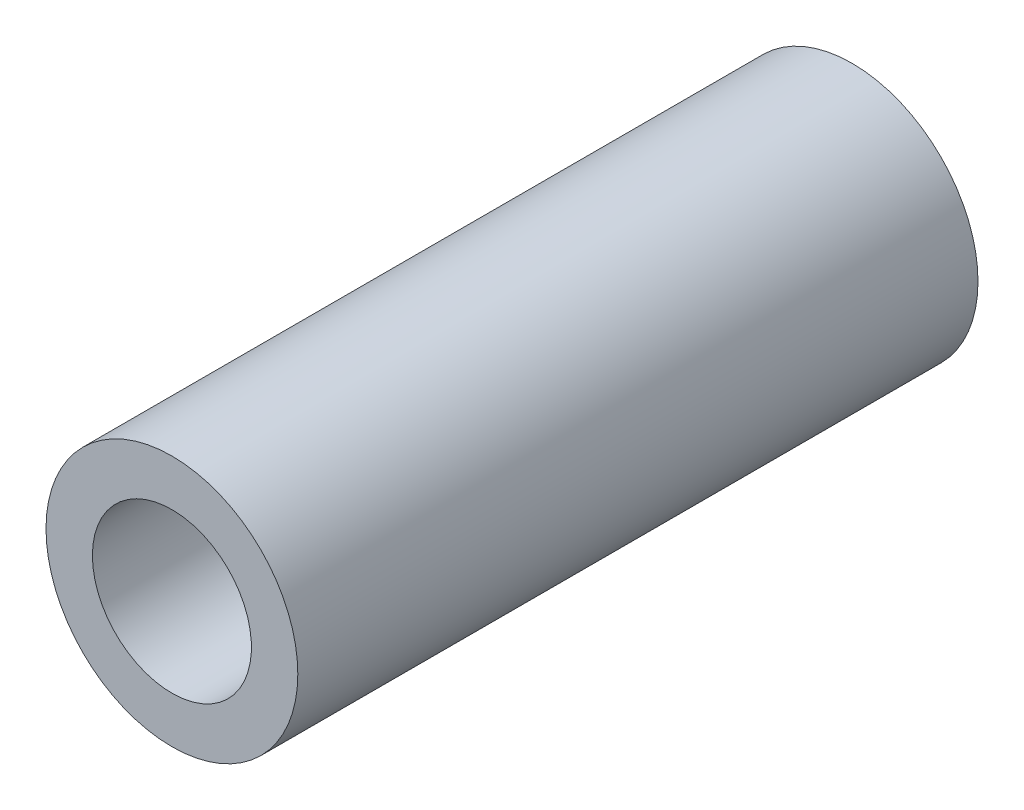
ISO-10303-21;
HEADER;
FILE_DESCRIPTION(('STEP AP214'),'2;1');
FILE_NAME('part.step','',(''),(''),'','','');
FILE_SCHEMA(('AUTOMOTIVE_DESIGN { 1 0 10303 214 1 1 1 1 }'));
ENDSEC;
DATA;
#1=APPLICATION_CONTEXT('core data for automotive mechanical design processes');
#2=APPLICATION_PROTOCOL_DEFINITION('international standard','automotive_design',2000,#1);
#3=PRODUCT_CONTEXT('',#1,'mechanical');
#4=PRODUCT('Part','Part','',(#3));
#5=PRODUCT_RELATED_PRODUCT_CATEGORY('part','',(#4));
#6=PRODUCT_DEFINITION_FORMATION('','',#4);
#7=PRODUCT_DEFINITION_CONTEXT('part definition',#1,'design');
#8=PRODUCT_DEFINITION('design','',#6,#7);
#9=PRODUCT_DEFINITION_SHAPE('','',#8);
#10=(LENGTH_UNIT() NAMED_UNIT(*) SI_UNIT(.MILLI.,.METRE.));
#11=(NAMED_UNIT(*) PLANE_ANGLE_UNIT() SI_UNIT($,.RADIAN.));
#12=(NAMED_UNIT(*) SI_UNIT($,.STERADIAN.) SOLID_ANGLE_UNIT());
#13=UNCERTAINTY_MEASURE_WITH_UNIT(LENGTH_MEASURE(1.E-05),#10,'distance_accuracy_value','');
#14=(GEOMETRIC_REPRESENTATION_CONTEXT(3) GLOBAL_UNCERTAINTY_ASSIGNED_CONTEXT((#13)) GLOBAL_UNIT_ASSIGNED_CONTEXT((#10,
#11,#12)) REPRESENTATION_CONTEXT('',''));
#15=CARTESIAN_POINT('',(0.,0.,0.));
#16=DIRECTION('',(0.,0.,1.));
#17=DIRECTION('',(1.,0.,0.));
#18=AXIS2_PLACEMENT_3D('',#15,#16,#17);
#19=CARTESIAN_POINT('',(0.,0.,6.415));
#20=DIRECTION('',(0.,0.,1.));
#21=DIRECTION('',(1.,0.,0.));
#22=AXIS2_PLACEMENT_3D('',#19,#20,#21);
#23=PLANE('',#22);
#24=CARTESIAN_POINT('',(0.,0.,6.415));
#25=DIRECTION('',(0.,0.,1.));
#26=DIRECTION('',(1.,0.,0.));
#27=AXIS2_PLACEMENT_3D('',#24,#25,#26);
#28=CIRCLE('',#27,2.375);
#29=CARTESIAN_POINT('',(-2.375,0.,6.415));
#30=VERTEX_POINT('',#29);
#31=EDGE_CURVE('E10',#30,#30,#28,.T.);
#32=ORIENTED_EDGE('',*,*,#31,.T.);
#33=EDGE_LOOP('',(#32));
#34=FACE_BOUND('',#33,.T.);
#35=CARTESIAN_POINT('',(0.,0.,6.415));
#36=DIRECTION('',(0.,0.,1.));
#37=DIRECTION('',(1.,0.,0.));
#38=AXIS2_PLACEMENT_3D('',#35,#36,#37);
#39=CIRCLE('',#38,1.5);
#40=CARTESIAN_POINT('',(-1.5,0.,6.415));
#41=VERTEX_POINT('',#40);
#42=EDGE_CURVE('E41',#41,#41,#39,.T.);
#43=ORIENTED_EDGE('',*,*,#42,.F.);
#44=EDGE_LOOP('',(#43));
#45=FACE_BOUND('',#44,.T.);
#46=ADVANCED_FACE('F30',(#34,#45),#23,.T.);
#47=CARTESIAN_POINT('',(0.,0.,-6.415));
#48=DIRECTION('',(0.,0.,1.));
#49=DIRECTION('',(1.,0.,0.));
#50=AXIS2_PLACEMENT_3D('',#47,#48,#49);
#51=PLANE('',#50);
#52=CARTESIAN_POINT('',(0.,0.,-6.415));
#53=DIRECTION('',(0.,0.,1.));
#54=DIRECTION('',(1.,0.,0.));
#55=AXIS2_PLACEMENT_3D('',#52,#53,#54);
#56=CIRCLE('',#55,2.375);
#57=CARTESIAN_POINT('',(-2.375,0.,-6.415));
#58=VERTEX_POINT('',#57);
#59=EDGE_CURVE('E34',#58,#58,#56,.T.);
#60=ORIENTED_EDGE('',*,*,#59,.F.);
#61=EDGE_LOOP('',(#60));
#62=FACE_BOUND('',#61,.T.);
#63=CARTESIAN_POINT('',(0.,0.,-6.415));
#64=DIRECTION('',(0.,0.,1.));
#65=DIRECTION('',(1.,0.,0.));
#66=AXIS2_PLACEMENT_3D('',#63,#64,#65);
#67=CIRCLE('',#66,1.5);
#68=CARTESIAN_POINT('',(-1.5,0.,-6.415));
#69=VERTEX_POINT('',#68);
#70=EDGE_CURVE('E43',#69,#69,#67,.T.);
#71=ORIENTED_EDGE('',*,*,#70,.T.);
#72=EDGE_LOOP('',(#71));
#73=FACE_BOUND('',#72,.T.);
#74=ADVANCED_FACE('F53',(#62,#73),#51,.F.);
#75=CARTESIAN_POINT('',(0.,0.,6.415));
#76=DIRECTION('',(0.,0.,-1.));
#77=DIRECTION('',(-1.,0.,0.));
#78=AXIS2_PLACEMENT_3D('',#75,#76,#77);
#79=CYLINDRICAL_SURFACE('',#78,2.375);
#80=CARTESIAN_POINT('',(-2.375,0.,6.415));
#81=CARTESIAN_POINT('',(-2.375,0.,6.28135416666666));
#82=CARTESIAN_POINT('',(-2.375,0.,6.14770833333333));
#83=CARTESIAN_POINT('',(-2.375,0.,5.88041666666667));
#84=CARTESIAN_POINT('',(-2.375,0.,5.74677083333333));
#85=CARTESIAN_POINT('',(-2.375,0.,5.47947916666667));
#86=CARTESIAN_POINT('',(-2.375,0.,5.34583333333333));
#87=CARTESIAN_POINT('',(-2.375,0.,5.07854166666667));
#88=CARTESIAN_POINT('',(-2.375,0.,4.94489583333333));
#89=CARTESIAN_POINT('',(-2.375,0.,4.67760416666667));
#90=CARTESIAN_POINT('',(-2.375,0.,4.54395833333333));
#91=CARTESIAN_POINT('',(-2.375,0.,4.27666666666667));
#92=CARTESIAN_POINT('',(-2.375,0.,4.14302083333333));
#93=CARTESIAN_POINT('',(-2.375,0.,3.87572916666667));
#94=CARTESIAN_POINT('',(-2.375,0.,3.74208333333333));
#95=CARTESIAN_POINT('',(-2.375,0.,3.47479166666667));
#96=CARTESIAN_POINT('',(-2.375,0.,3.34114583333333));
#97=CARTESIAN_POINT('',(-2.375,0.,3.07385416666667));
#98=CARTESIAN_POINT('',(-2.375,0.,2.94020833333333));
#99=CARTESIAN_POINT('',(-2.375,0.,2.67291666666667));
#100=CARTESIAN_POINT('',(-2.375,0.,2.53927083333333));
#101=CARTESIAN_POINT('',(-2.375,0.,2.27197916666667));
#102=CARTESIAN_POINT('',(-2.375,0.,2.13833333333333));
#103=CARTESIAN_POINT('',(-2.375,0.,1.87104166666667));
#104=CARTESIAN_POINT('',(-2.375,0.,1.73739583333333));
#105=CARTESIAN_POINT('',(-2.375,0.,1.47010416666667));
#106=CARTESIAN_POINT('',(-2.375,0.,1.33645833333333));
#107=CARTESIAN_POINT('',(-2.375,0.,1.06916666666667));
#108=CARTESIAN_POINT('',(-2.375,0.,0.935520833333333));
#109=CARTESIAN_POINT('',(-2.375,0.,0.668229166666666));
#110=CARTESIAN_POINT('',(-2.375,0.,0.534583333333333));
#111=CARTESIAN_POINT('',(-2.375,0.,0.267291666666666));
#112=CARTESIAN_POINT('',(-2.375,0.,0.133645833333333));
#113=CARTESIAN_POINT('',(-2.375,0.,-0.133645833333334));
#114=CARTESIAN_POINT('',(-2.375,0.,-0.267291666666668));
#115=CARTESIAN_POINT('',(-2.375,0.,-0.534583333333335));
#116=CARTESIAN_POINT('',(-2.375,0.,-0.668229166666668));
#117=CARTESIAN_POINT('',(-2.375,0.,-0.935520833333335));
#118=CARTESIAN_POINT('',(-2.375,0.,-1.06916666666667));
#119=CARTESIAN_POINT('',(-2.375,0.,-1.33645833333333));
#120=CARTESIAN_POINT('',(-2.375,0.,-1.47010416666667));
#121=CARTESIAN_POINT('',(-2.375,0.,-1.73739583333333));
#122=CARTESIAN_POINT('',(-2.375,0.,-1.87104166666667));
#123=CARTESIAN_POINT('',(-2.375,0.,-2.13833333333333));
#124=CARTESIAN_POINT('',(-2.375,0.,-2.27197916666667));
#125=CARTESIAN_POINT('',(-2.375,0.,-2.53927083333333));
#126=CARTESIAN_POINT('',(-2.375,0.,-2.67291666666667));
#127=CARTESIAN_POINT('',(-2.375,0.,-2.94020833333333));
#128=CARTESIAN_POINT('',(-2.375,0.,-3.07385416666667));
#129=CARTESIAN_POINT('',(-2.375,0.,-3.34114583333333));
#130=CARTESIAN_POINT('',(-2.375,0.,-3.47479166666667));
#131=CARTESIAN_POINT('',(-2.375,0.,-3.74208333333333));
#132=CARTESIAN_POINT('',(-2.375,0.,-3.87572916666667));
#133=CARTESIAN_POINT('',(-2.375,0.,-4.14302083333333));
#134=CARTESIAN_POINT('',(-2.375,0.,-4.27666666666667));
#135=CARTESIAN_POINT('',(-2.375,0.,-4.54395833333333));
#136=CARTESIAN_POINT('',(-2.375,0.,-4.67760416666667));
#137=CARTESIAN_POINT('',(-2.375,0.,-4.94489583333333));
#138=CARTESIAN_POINT('',(-2.375,0.,-5.07854166666667));
#139=CARTESIAN_POINT('',(-2.375,0.,-5.34583333333333));
#140=CARTESIAN_POINT('',(-2.375,0.,-5.47947916666667));
#141=CARTESIAN_POINT('',(-2.375,0.,-5.74677083333333));
#142=CARTESIAN_POINT('',(-2.375,0.,-5.88041666666667));
#143=CARTESIAN_POINT('',(-2.375,0.,-6.14770833333333));
#144=CARTESIAN_POINT('',(-2.375,0.,-6.28135416666667));
#145=CARTESIAN_POINT('',(-2.375,0.,-6.415));
#146=B_SPLINE_CURVE_WITH_KNOTS('',3,(#80,#81,#82,#83,#84,#85,#86,#87,#88,#89,#90,#91,#92,#93,
#94,#95,#96,#97,#98,#99,#100,#101,#102,#103,#104,#105,#106,#107,#108,#109,#110,#111,#112,#113,
#114,#115,#116,#117,#118,#119,#120,#121,#122,#123,#124,#125,#126,#127,#128,#129,#130,#131,#132,
#133,#134,#135,#136,#137,#138,#139,#140,#141,#142,#143,#144,#145),.UNSPECIFIED.,.F.,.F.,(4,2,2,
2,2,2,2,2,2,2,2,2,2,2,2,2,2,2,2,2,2,2,2,2,2,2,2,2,2,2,2,2,4),(0.,0.400937499999999,0.801875,
1.2028125,1.60375,2.0046875,2.405625,2.8065625,3.2075,3.6084375,4.009375,4.4103125,4.81125,
5.2121875,5.613125,6.0140625,6.415,6.8159375,7.216875,7.6178125,8.01875,8.4196875,8.820625,
9.2215625,9.6225,10.0234375,10.424375,10.8253125,11.22625,11.6271875,12.028125,12.4290625,
12.83),.UNSPECIFIED.);
#147=EDGE_CURVE('BSEAM32',#30,#58,#146,.T.);
#148=ORIENTED_EDGE('',*,*,#31,.F.);
#149=ORIENTED_EDGE('',*,*,#59,.T.);
#150=ORIENTED_EDGE('',*,*,#147,.T.);
#151=ORIENTED_EDGE('',*,*,#147,.F.);
#152=EDGE_LOOP('',(#148,#150,#149,#151));
#153=FACE_BOUND('',#152,.T.);
#154=ADVANCED_FACE('F32',(#153),#79,.T.);
#155=CARTESIAN_POINT('',(0.,0.,6.415));
#156=DIRECTION('',(0.,0.,-1.));
#157=DIRECTION('',(-1.,0.,0.));
#158=AXIS2_PLACEMENT_3D('',#155,#156,#157);
#159=CYLINDRICAL_SURFACE('',#158,1.5);
#160=CARTESIAN_POINT('',(-1.5,0.,6.415));
#161=CARTESIAN_POINT('',(-1.5,0.,6.28135416666667));
#162=CARTESIAN_POINT('',(-1.5,0.,6.14770833333333));
#163=CARTESIAN_POINT('',(-1.5,0.,5.88041666666667));
#164=CARTESIAN_POINT('',(-1.5,0.,5.74677083333333));
#165=CARTESIAN_POINT('',(-1.5,0.,5.47947916666667));
#166=CARTESIAN_POINT('',(-1.5,0.,5.34583333333333));
#167=CARTESIAN_POINT('',(-1.5,0.,5.07854166666667));
#168=CARTESIAN_POINT('',(-1.5,0.,4.94489583333333));
#169=CARTESIAN_POINT('',(-1.5,0.,4.67760416666667));
#170=CARTESIAN_POINT('',(-1.5,0.,4.54395833333333));
#171=CARTESIAN_POINT('',(-1.5,0.,4.27666666666667));
#172=CARTESIAN_POINT('',(-1.5,0.,4.14302083333333));
#173=CARTESIAN_POINT('',(-1.5,0.,3.87572916666667));
#174=CARTESIAN_POINT('',(-1.5,0.,3.74208333333333));
#175=CARTESIAN_POINT('',(-1.5,0.,3.47479166666667));
#176=CARTESIAN_POINT('',(-1.5,0.,3.34114583333333));
#177=CARTESIAN_POINT('',(-1.5,0.,3.07385416666667));
#178=CARTESIAN_POINT('',(-1.5,0.,2.94020833333333));
#179=CARTESIAN_POINT('',(-1.5,0.,2.67291666666667));
#180=CARTESIAN_POINT('',(-1.5,0.,2.53927083333333));
#181=CARTESIAN_POINT('',(-1.5,0.,2.27197916666667));
#182=CARTESIAN_POINT('',(-1.5,0.,2.13833333333333));
#183=CARTESIAN_POINT('',(-1.5,0.,1.87104166666667));
#184=CARTESIAN_POINT('',(-1.5,0.,1.73739583333333));
#185=CARTESIAN_POINT('',(-1.5,0.,1.47010416666667));
#186=CARTESIAN_POINT('',(-1.5,0.,1.33645833333333));
#187=CARTESIAN_POINT('',(-1.5,0.,1.06916666666667));
#188=CARTESIAN_POINT('',(-1.5,0.,0.935520833333334));
#189=CARTESIAN_POINT('',(-1.5,0.,0.668229166666667));
#190=CARTESIAN_POINT('',(-1.5,0.,0.534583333333334));
#191=CARTESIAN_POINT('',(-1.5,0.,0.267291666666667));
#192=CARTESIAN_POINT('',(-1.5,0.,0.133645833333333));
#193=CARTESIAN_POINT('',(-1.5,0.,-0.133645833333333));
#194=CARTESIAN_POINT('',(-1.5,0.,-0.267291666666667));
#195=CARTESIAN_POINT('',(-1.5,0.,-0.534583333333334));
#196=CARTESIAN_POINT('',(-1.5,0.,-0.668229166666667));
#197=CARTESIAN_POINT('',(-1.5,0.,-0.935520833333334));
#198=CARTESIAN_POINT('',(-1.5,0.,-1.06916666666667));
#199=CARTESIAN_POINT('',(-1.5,0.,-1.33645833333333));
#200=CARTESIAN_POINT('',(-1.5,0.,-1.47010416666667));
#201=CARTESIAN_POINT('',(-1.5,0.,-1.73739583333333));
#202=CARTESIAN_POINT('',(-1.5,0.,-1.87104166666667));
#203=CARTESIAN_POINT('',(-1.5,0.,-2.13833333333333));
#204=CARTESIAN_POINT('',(-1.5,0.,-2.27197916666667));
#205=CARTESIAN_POINT('',(-1.5,0.,-2.53927083333333));
#206=CARTESIAN_POINT('',(-1.5,0.,-2.67291666666667));
#207=CARTESIAN_POINT('',(-1.5,0.,-2.94020833333333));
#208=CARTESIAN_POINT('',(-1.5,0.,-3.07385416666667));
#209=CARTESIAN_POINT('',(-1.5,0.,-3.34114583333333));
#210=CARTESIAN_POINT('',(-1.5,0.,-3.47479166666667));
#211=CARTESIAN_POINT('',(-1.5,0.,-3.74208333333333));
#212=CARTESIAN_POINT('',(-1.5,0.,-3.87572916666667));
#213=CARTESIAN_POINT('',(-1.5,0.,-4.14302083333333));
#214=CARTESIAN_POINT('',(-1.5,0.,-4.27666666666667));
#215=CARTESIAN_POINT('',(-1.5,0.,-4.54395833333333));
#216=CARTESIAN_POINT('',(-1.5,0.,-4.67760416666667));
#217=CARTESIAN_POINT('',(-1.5,0.,-4.94489583333333));
#218=CARTESIAN_POINT('',(-1.5,0.,-5.07854166666667));
#219=CARTESIAN_POINT('',(-1.5,0.,-5.34583333333333));
#220=CARTESIAN_POINT('',(-1.5,0.,-5.47947916666667));
#221=CARTESIAN_POINT('',(-1.5,0.,-5.74677083333333));
#222=CARTESIAN_POINT('',(-1.5,0.,-5.88041666666667));
#223=CARTESIAN_POINT('',(-1.5,0.,-6.14770833333333));
#224=CARTESIAN_POINT('',(-1.5,0.,-6.28135416666667));
#225=CARTESIAN_POINT('',(-1.5,0.,-6.415));
#226=B_SPLINE_CURVE_WITH_KNOTS('',3,(#160,#161,#162,#163,#164,#165,#166,#167,#168,#169,#170,
#171,#172,#173,#174,#175,#176,#177,#178,#179,#180,#181,#182,#183,#184,#185,#186,#187,#188,#189,
#190,#191,#192,#193,#194,#195,#196,#197,#198,#199,#200,#201,#202,#203,#204,#205,#206,#207,#208,
#209,#210,#211,#212,#213,#214,#215,#216,#217,#218,#219,#220,#221,#222,#223,#224,#225),
.UNSPECIFIED.,.F.,.F.,(4,2,2,2,2,2,2,2,2,2,2,2,2,2,2,2,2,2,2,2,2,2,2,2,2,2,2,2,2,2,2,2,4),(0.,
0.4009375,0.801875000000001,1.2028125,1.60375,2.0046875,2.405625,2.8065625,3.2075,3.6084375,
4.009375,4.4103125,4.81125,5.2121875,5.613125,6.0140625,6.415,6.8159375,7.216875,7.6178125,
8.01875,8.4196875,8.820625,9.2215625,9.6225,10.0234375,10.424375,10.8253125,11.22625,11.6271875,
12.028125,12.4290625,12.83),.UNSPECIFIED.);
#227=EDGE_CURVE('BSEAM49',#41,#69,#226,.T.);
#228=ORIENTED_EDGE('',*,*,#42,.T.);
#229=ORIENTED_EDGE('',*,*,#70,.F.);
#230=ORIENTED_EDGE('',*,*,#227,.T.);
#231=ORIENTED_EDGE('',*,*,#227,.F.);
#232=EDGE_LOOP('',(#228,#230,#229,#231));
#233=FACE_BOUND('',#232,.T.);
#234=ADVANCED_FACE('F49',(#233),#159,.F.);
#235=CLOSED_SHELL('',(#46,#74,#154,#234));
#236=MANIFOLD_SOLID_BREP('B2',#235);
#237=ADVANCED_BREP_SHAPE_REPRESENTATION('',(#18,#236),#14);
#238=SHAPE_DEFINITION_REPRESENTATION(#9,#237);
ENDSEC;
END-ISO-10303-21;
